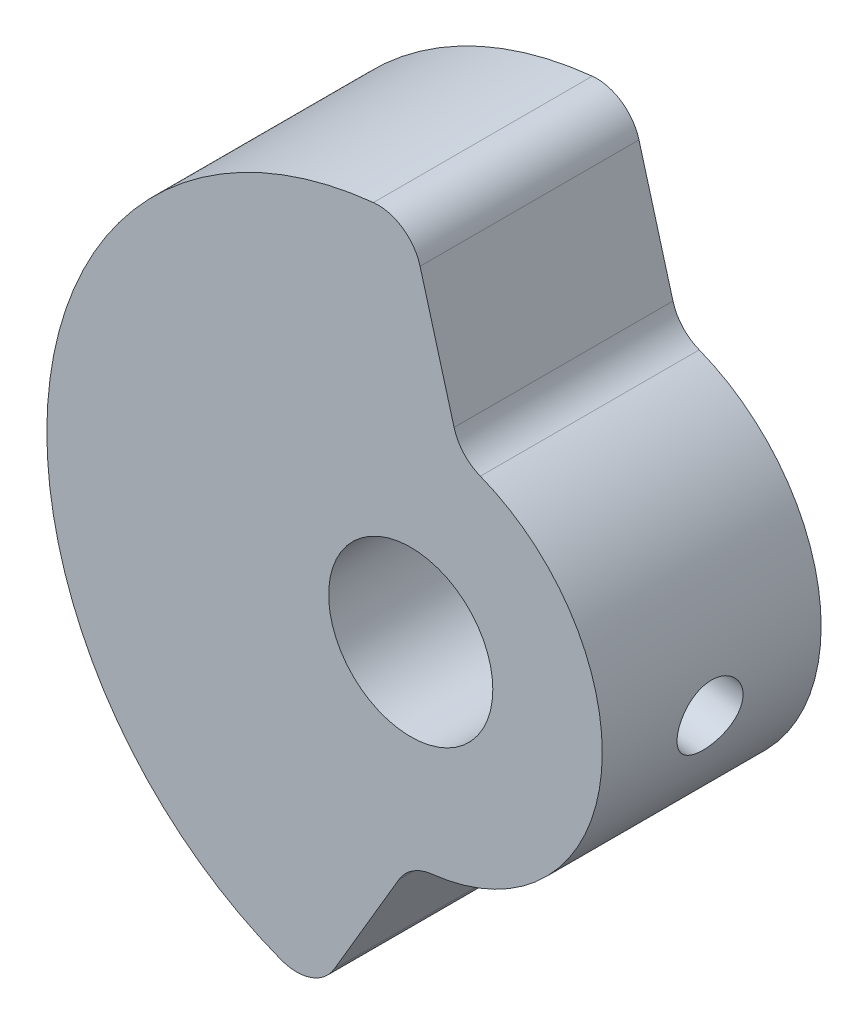
ISO-10303-21;
HEADER;
FILE_DESCRIPTION(('STEP AP214'),'2;1');
FILE_NAME('part.step','',(''),(''),'','','');
FILE_SCHEMA(('AUTOMOTIVE_DESIGN { 1 0 10303 214 1 1 1 1 }'));
ENDSEC;
DATA;
#1=APPLICATION_CONTEXT('core data for automotive mechanical design processes');
#2=APPLICATION_PROTOCOL_DEFINITION('international standard','automotive_design',2000,#1);
#3=PRODUCT_CONTEXT('',#1,'mechanical');
#4=PRODUCT('Part','Part','',(#3));
#5=PRODUCT_RELATED_PRODUCT_CATEGORY('part','',(#4));
#6=PRODUCT_DEFINITION_FORMATION('','',#4);
#7=PRODUCT_DEFINITION_CONTEXT('part definition',#1,'design');
#8=PRODUCT_DEFINITION('design','',#6,#7);
#9=PRODUCT_DEFINITION_SHAPE('','',#8);
#10=(LENGTH_UNIT() NAMED_UNIT(*) SI_UNIT(.MILLI.,.METRE.));
#11=(NAMED_UNIT(*) PLANE_ANGLE_UNIT() SI_UNIT($,.RADIAN.));
#12=(NAMED_UNIT(*) SI_UNIT($,.STERADIAN.) SOLID_ANGLE_UNIT());
#13=UNCERTAINTY_MEASURE_WITH_UNIT(LENGTH_MEASURE(1.E-05),#10,'distance_accuracy_value','');
#14=(GEOMETRIC_REPRESENTATION_CONTEXT(3) GLOBAL_UNCERTAINTY_ASSIGNED_CONTEXT((#13)) GLOBAL_UNIT_ASSIGNED_CONTEXT((#10,
#11,#12)) REPRESENTATION_CONTEXT('',''));
#15=CARTESIAN_POINT('',(0.,0.,0.));
#16=DIRECTION('',(0.,0.,1.));
#17=DIRECTION('',(1.,0.,0.));
#18=AXIS2_PLACEMENT_3D('',#15,#16,#17);
#19=CARTESIAN_POINT('',(5.43342531874596,1.50570839365895,12.7));
#20=DIRECTION('',(0.963681307706312,0.267054932883577,0.));
#21=DIRECTION('',(-0.267054932883577,0.963681307706312,0.));
#22=AXIS2_PLACEMENT_3D('',#19,#20,#21);
#23=PLANE('',#22);
#24=DIRECTION('',(0.267054932883577,-0.963681307706312,0.));
#25=VECTOR('',#24,1.);
#26=CARTESIAN_POINT('',(5.43342531874596,1.50570839365895,12.7));
#27=LINE('',#26,#25);
#28=CARTESIAN_POINT('',(0.543045489634812,19.1528927313957,12.7));
#29=VERTEX_POINT('',#28);
#30=CARTESIAN_POINT('',(2.51399029947362,12.0406381429719,12.7));
#31=VERTEX_POINT('',#30);
#32=EDGE_CURVE('E135',#29,#31,#27,.T.);
#33=ORIENTED_EDGE('',*,*,#32,.T.);
#34=DIRECTION('',(0.,0.,-1.));
#35=VECTOR('',#34,1.);
#36=CARTESIAN_POINT('',(2.51399029947362,12.0406381429719,12.7));
#37=LINE('',#36,#35);
#38=CARTESIAN_POINT('',(2.51399029947362,12.0406381429719,0.));
#39=VERTEX_POINT('',#38);
#40=EDGE_CURVE('E147',#31,#39,#37,.T.);
#41=ORIENTED_EDGE('',*,*,#40,.T.);
#42=DIRECTION('',(0.267054932883577,-0.963681307706312,0.));
#43=VECTOR('',#42,1.);
#44=CARTESIAN_POINT('',(5.43342531874596,1.50570839365895,0.));
#45=LINE('',#44,#43);
#46=CARTESIAN_POINT('',(0.543045489634812,19.1528927313957,0.));
#47=VERTEX_POINT('',#46);
#48=EDGE_CURVE('E177',#47,#39,#45,.T.);
#49=ORIENTED_EDGE('',*,*,#48,.F.);
#50=DIRECTION('',(0.,0.,1.));
#51=VECTOR('',#50,1.);
#52=CARTESIAN_POINT('',(0.543045489634813,19.1528927313957,12.7));
#53=LINE('',#52,#51);
#54=EDGE_CURVE('E145',#47,#29,#53,.T.);
#55=ORIENTED_EDGE('',*,*,#54,.T.);
#56=EDGE_LOOP('',(#33,#41,#49,#55));
#57=FACE_BOUND('',#56,.T.);
#58=ADVANCED_FACE('F39',(#57),#23,.T.);
#59=CARTESIAN_POINT('',(0.,0.,12.7));
#60=DIRECTION('',(0.,0.,-1.));
#61=DIRECTION('',(-1.,0.,0.));
#62=AXIS2_PLACEMENT_3D('',#59,#60,#61);
#63=CYLINDRICAL_SURFACE('',#62,21.1125);
#64=CARTESIAN_POINT('',(0.,0.,0.));
#65=DIRECTION('',(0.,0.,1.));
#66=DIRECTION('',(1.,0.,0.));
#67=AXIS2_PLACEMENT_3D('',#64,#65,#66);
#68=CIRCLE('',#67,21.1125);
#69=CARTESIAN_POINT('',(-2.16519504572981,21.0011806016697,0.));
#70=VERTEX_POINT('',#69);
#71=CARTESIAN_POINT('',(-7.5269233229733,-19.7251890115172,0.));
#72=VERTEX_POINT('',#71);
#73=EDGE_CURVE('E137',#70,#72,#68,.T.);
#74=ORIENTED_EDGE('',*,*,#73,.T.);
#75=DIRECTION('',(0.,0.,-1.));
#76=VECTOR('',#75,1.);
#77=CARTESIAN_POINT('',(-7.5269233229733,-19.7251890115172,12.7));
#78=LINE('',#77,#76);
#79=CARTESIAN_POINT('',(-7.5269233229733,-19.7251890115172,12.7));
#80=VERTEX_POINT('',#79);
#81=EDGE_CURVE('E54',#72,#80,#78,.F.);
#82=ORIENTED_EDGE('',*,*,#81,.T.);
#83=CARTESIAN_POINT('',(0.,0.,12.7));
#84=DIRECTION('',(0.,0.,1.));
#85=DIRECTION('',(1.,0.,0.));
#86=AXIS2_PLACEMENT_3D('',#83,#84,#85);
#87=CIRCLE('',#86,21.1125);
#88=CARTESIAN_POINT('',(-2.16519504572981,21.0011806016697,12.7));
#89=VERTEX_POINT('',#88);
#90=EDGE_CURVE('E168',#89,#80,#87,.T.);
#91=ORIENTED_EDGE('',*,*,#90,.F.);
#92=DIRECTION('',(0.,0.,-1.));
#93=VECTOR('',#92,1.);
#94=CARTESIAN_POINT('',(-2.16519504572981,21.0011806016697,12.7));
#95=LINE('',#94,#93);
#96=EDGE_CURVE('E154',#89,#70,#95,.T.);
#97=ORIENTED_EDGE('',*,*,#96,.T.);
#98=EDGE_LOOP('',(#74,#82,#91,#97));
#99=FACE_BOUND('',#98,.T.);
#100=ADVANCED_FACE('F180',(#99),#63,.T.);
#101=CARTESIAN_POINT('',(4.85857983193997,-2.8606765769291,12.7));
#102=DIRECTION('',(0.861725760706704,-0.507374332553838,0.));
#103=DIRECTION('',(0.507374332553838,0.861725760706704,0.));
#104=AXIS2_PLACEMENT_3D('',#101,#102,#103);
#105=PLANE('',#104);
#106=DIRECTION('',(-0.507374332553838,-0.861725760706704,0.));
#107=VECTOR('',#106,1.);
#108=CARTESIAN_POINT('',(4.85857983193997,-2.8606765769291,0.));
#109=LINE('',#108,#107);
#110=CARTESIAN_POINT('',(-0.688018309287222,-12.2810319160046,0.));
#111=VERTEX_POINT('',#110);
#112=CARTESIAN_POINT('',(-4.4325917444028,-18.6408242524738,0.));
#113=VERTEX_POINT('',#112);
#114=EDGE_CURVE('E132',#111,#113,#109,.T.);
#115=ORIENTED_EDGE('',*,*,#114,.F.);
#116=DIRECTION('',(0.,0.,-1.));
#117=VECTOR('',#116,1.);
#118=CARTESIAN_POINT('',(-0.688018309287221,-12.2810319160046,12.7));
#119=LINE('',#118,#117);
#120=CARTESIAN_POINT('',(-0.688018309287222,-12.2810319160046,12.7));
#121=VERTEX_POINT('',#120);
#122=EDGE_CURVE('E110',#111,#121,#119,.F.);
#123=ORIENTED_EDGE('',*,*,#122,.T.);
#124=DIRECTION('',(-0.507374332553838,-0.861725760706704,0.));
#125=VECTOR('',#124,1.);
#126=CARTESIAN_POINT('',(4.85857983193997,-2.8606765769291,12.7));
#127=LINE('',#126,#125);
#128=CARTESIAN_POINT('',(-4.4325917444028,-18.6408242524738,12.7));
#129=VERTEX_POINT('',#128);
#130=EDGE_CURVE('E164',#121,#129,#127,.T.);
#131=ORIENTED_EDGE('',*,*,#130,.T.);
#132=DIRECTION('',(0.,0.,1.));
#133=VECTOR('',#132,1.);
#134=CARTESIAN_POINT('',(-4.4325917444028,-18.6408242524738,0.));
#135=LINE('',#134,#133);
#136=EDGE_CURVE('E126',#129,#113,#135,.F.);
#137=ORIENTED_EDGE('',*,*,#136,.T.);
#138=EDGE_LOOP('',(#115,#123,#131,#137));
#139=FACE_BOUND('',#138,.T.);
#140=ADVANCED_FACE('F184',(#139),#105,.T.);
#141=CARTESIAN_POINT('',(0.,0.,12.7));
#142=DIRECTION('',(0.,0.,-1.));
#143=DIRECTION('',(-1.,0.,0.));
#144=AXIS2_PLACEMENT_3D('',#141,#142,#143);
#145=CYLINDRICAL_SURFACE('',#144,4.7625);
#146=CARTESIAN_POINT('',(4.57649482557353,1.31799141176969,6.35));
#147=CARTESIAN_POINT('',(4.5765035003887,1.3179790913622,6.24825854889232));
#148=CARTESIAN_POINT('',(4.57900603689043,1.30936790539881,6.14637142960715));
#149=CARTESIAN_POINT('',(4.58861076313625,1.27528431465179,5.94551805016252));
#150=CARTESIAN_POINT('',(4.59572475292533,1.24976865003831,5.8465599661598));
#151=CARTESIAN_POINT('',(4.61332879952334,1.18312217209409,5.65480991178216));
#152=CARTESIAN_POINT('',(4.62380616708721,1.14204994692109,5.56199632249306));
#153=CARTESIAN_POINT('',(4.64652081154571,1.04579436279778,5.38431394743353));
#154=CARTESIAN_POINT('',(4.65875769520724,0.990614154692842,5.2994433934575));
#155=CARTESIAN_POINT('',(4.68383138060495,0.864558047658976,5.13518589327512));
#156=CARTESIAN_POINT('',(4.69666661754263,0.793020091962644,5.05630656503448));
#157=CARTESIAN_POINT('',(4.72022592343371,0.637979512650587,4.91091532147242));
#158=CARTESIAN_POINT('',(4.73094925725567,0.55447274022887,4.8444077130629));
#159=CARTESIAN_POINT('',(4.74868238802908,0.374085241586445,4.72313378240749));
#160=CARTESIAN_POINT('',(4.75553046938425,0.276809075867375,4.6689286773879));
#161=CARTESIAN_POINT('',(4.7629951953723,0.0743236467275271,4.57758174027642));
#162=CARTESIAN_POINT('',(4.76361436185257,-0.0308823888125432,4.54043300853088));
#163=CARTESIAN_POINT('',(4.75751359187605,-0.240731951328283,4.48606269799038));
#164=CARTESIAN_POINT('',(4.75114542558981,-0.345158877277574,4.46796813989771));
#165=CARTESIAN_POINT('',(4.73123602626295,-0.554878351393519,4.44940953503026));
#166=CARTESIAN_POINT('',(4.71769745198341,-0.660170564477526,4.44893895798278));
#167=CARTESIAN_POINT('',(4.68482533031828,-0.862400609743883,4.46516144350376));
#168=CARTESIAN_POINT('',(4.66585731417635,-0.959476766199499,4.4808981992074));
#169=CARTESIAN_POINT('',(4.62289689054303,-1.14876191239522,4.52746301204533));
#170=CARTESIAN_POINT('',(4.59890411465393,-1.24097054464459,4.5582921759237));
#171=CARTESIAN_POINT('',(4.5469493748961,-1.41966680972163,4.63454594874746));
#172=CARTESIAN_POINT('',(4.51893310687645,-1.50604745001541,4.68018324592099));
#173=CARTESIAN_POINT('',(4.46102507018394,-1.66979513841288,4.78455915718808));
#174=CARTESIAN_POINT('',(4.43113266303987,-1.74715909216696,4.84330224889569));
#175=CARTESIAN_POINT('',(4.36952393988176,-1.89620400873576,4.97669163092466));
#176=CARTESIAN_POINT('',(4.33781592412643,-1.967184459157,5.05212566716467));
#177=CARTESIAN_POINT('',(4.27708381927617,-2.09595809568712,5.21450348241173));
#178=CARTESIAN_POINT('',(4.24806059859108,-2.15374702374397,5.30145096353974));
#179=CARTESIAN_POINT('',(4.19455745996124,-2.25622218809871,5.48747790762721));
#180=CARTESIAN_POINT('',(4.17022687744854,-2.30049791470839,5.58682815474876));
#181=CARTESIAN_POINT('',(4.12980814764151,-2.37230034274375,5.79297055153924));
#182=CARTESIAN_POINT('',(4.11371469020227,-2.39983783679155,5.89975785625664));
#183=CARTESIAN_POINT('',(4.09241814369781,-2.43596718224047,6.11080634664625));
#184=CARTESIAN_POINT('',(4.0866125649153,-2.44560886545311,6.2148265451844));
#185=CARTESIAN_POINT('',(4.08471043991915,-2.44878643405441,6.42318603263268));
#186=CARTESIAN_POINT('',(4.08861097999804,-2.44232715283645,6.52752521639412));
#187=CARTESIAN_POINT('',(4.10515561160564,-2.41440186923083,6.72737314328988));
#188=CARTESIAN_POINT('',(4.1172940075421,-2.39380305277959,6.82304797588751));
#189=CARTESIAN_POINT('',(4.14855367401966,-2.3392073120076,7.00928672988511));
#190=CARTESIAN_POINT('',(4.16767648636103,-2.30520742928872,7.09984951770805));
#191=CARTESIAN_POINT('',(4.21206999769849,-2.22308988130137,7.27737295640481));
#192=CARTESIAN_POINT('',(4.23755786010531,-2.17445735017657,7.36404026732357));
#193=CARTESIAN_POINT('',(4.29207355717854,-2.06476579579727,7.52789189723617));
#194=CARTESIAN_POINT('',(4.32110282410147,-2.00370173811671,7.60507235394205));
#195=CARTESIAN_POINT('',(4.38268374812765,-1.86537456322684,7.75363766651749));
#196=CARTESIAN_POINT('',(4.41533763910642,-1.78725228126425,7.82418334339339));
#197=CARTESIAN_POINT('',(4.47956286710892,-1.61956000939682,7.9506938780632));
#198=CARTESIAN_POINT('',(4.51113416253095,-1.52998958018924,8.00665817607154));
#199=CARTESIAN_POINT('',(4.57074610989932,-1.34143440974871,8.10220041692598));
#200=CARTESIAN_POINT('',(4.59878830927119,-1.24245382830189,8.14178555918838));
#201=CARTESIAN_POINT('',(4.64925449829528,-1.03774994760261,8.20301324182446));
#202=CARTESIAN_POINT('',(4.67168150980392,-0.932030313622901,8.22466544748846));
#203=CARTESIAN_POINT('',(4.70822436234517,-0.724182079828701,8.24827018035336));
#204=CARTESIAN_POINT('',(4.72278497783695,-0.622265418297731,8.25140952418151));
#205=CARTESIAN_POINT('',(4.74517784768901,-0.418553939784576,8.24102907101579));
#206=CARTESIAN_POINT('',(4.75301110852388,-0.31675910685213,8.22751176674786));
#207=CARTESIAN_POINT('',(4.76199736054659,-0.119414258209948,8.18504923974241));
#208=CARTESIAN_POINT('',(4.76334592252221,-0.0237684773881169,8.15658481016413));
#209=CARTESIAN_POINT('',(4.76065049011924,0.16203393232593,8.0855396852664));
#210=CARTESIAN_POINT('',(4.75660549750984,0.252189541876132,8.04295637794274));
#211=CARTESIAN_POINT('',(4.74402814313224,0.428692536269111,7.94276555532535));
#212=CARTESIAN_POINT('',(4.73530577101277,0.514696688099277,7.88457833224135));
#213=CARTESIAN_POINT('',(4.71492883507228,0.676391427690234,7.75570070759385));
#214=CARTESIAN_POINT('',(4.70327306831053,0.752077764592488,7.68500518010468));
#215=CARTESIAN_POINT('',(4.6781346802911,0.895597247433175,7.52798777584434));
#216=CARTESIAN_POINT('',(4.6645838298356,0.962662781654232,7.44097292355135));
#217=CARTESIAN_POINT('',(4.63857966928379,1.0810529320265,7.25660712002378));
#218=CARTESIAN_POINT('',(4.62612649132042,1.13237565496723,7.15925492752739));
#219=CARTESIAN_POINT('',(4.60548483932956,1.21347002062128,6.96582193643155));
#220=CARTESIAN_POINT('',(4.59701459570469,1.24475835485225,6.87040582888302));
#221=CARTESIAN_POINT('',(4.58416634426781,1.29129003148744,6.67564287335857));
#222=CARTESIAN_POINT('',(4.57977691244876,1.3065781807225,6.57630781501907));
#223=CARTESIAN_POINT('',(4.57691679435516,1.31652186394179,6.43438697538482));
#224=CARTESIAN_POINT('',(4.57649122694748,1.31799652271886,6.39220602163411));
#225=CARTESIAN_POINT('',(4.57649482557353,1.31799141176969,6.35));
#226=B_SPLINE_CURVE_WITH_KNOTS('',3,(#146,#147,#148,#149,#150,#151,#152,#153,#154,#155,#156,
#157,#158,#159,#160,#161,#162,#163,#164,#165,#166,#167,#168,#169,#170,#171,#172,#173,#174,#175,
#176,#177,#178,#179,#180,#181,#182,#183,#184,#185,#186,#187,#188,#189,#190,#191,#192,#193,#194,
#195,#196,#197,#198,#199,#200,#201,#202,#203,#204,#205,#206,#207,#208,#209,#210,#211,#212,#213,
#214,#215,#216,#217,#218,#219,#220,#221,#222,#223,#224,#225),.UNSPECIFIED.,.T.,.F.,(4,2,2,2,2,2,
2,2,2,2,2,2,2,2,2,2,2,2,2,2,2,2,2,2,2,2,2,2,2,2,2,2,2,2,2,2,2,2,2,4),(0.,0.305093849963129,
0.610971489482487,0.915708424940186,1.22037736049339,1.54073919281255,1.86121234340843,
2.19422460825775,2.52710204385605,2.84395930285961,3.16069915452013,3.45976416385432,
3.75885110726394,4.06243952061923,4.36613181467221,4.68964610005576,5.01326466444634,
5.34591141592365,5.67834345239779,5.99056931291459,6.30270145676866,6.59722418736117,
6.89181197277322,7.19830112258992,7.50491463986565,7.8339971814367,8.16309235477079,
8.4920427210975,8.8208156779082,9.1282608702742,9.4356600579738,9.73372769878002,
10.0318505131461,10.3431193970311,10.6545161361646,10.9850342935788,11.3155921831175,
11.616592463761,11.9167475508272,12.0433114782313),.UNSPECIFIED.);
#227=CARTESIAN_POINT('',(4.57649482557353,1.31799141176969,6.35));
#228=VERTEX_POINT('',#227);
#229=EDGE_CURVE('E227',#228,#228,#226,.T.);
#230=ORIENTED_EDGE('',*,*,#229,.F.);
#231=EDGE_LOOP('',(#230));
#232=FACE_BOUND('',#231,.T.);
#233=CARTESIAN_POINT('',(0.,0.,12.7));
#234=DIRECTION('',(0.,0.,1.));
#235=DIRECTION('',(1.,0.,0.));
#236=AXIS2_PLACEMENT_3D('',#233,#234,#235);
#237=CIRCLE('',#236,4.7625);
#238=CARTESIAN_POINT('',(4.7625,0.,12.7));
#239=VERTEX_POINT('',#238);
#240=EDGE_CURVE('E131',#239,#239,#237,.T.);
#241=ORIENTED_EDGE('',*,*,#240,.T.);
#242=EDGE_LOOP('',(#241));
#243=FACE_BOUND('',#242,.T.);
#244=CARTESIAN_POINT('',(0.,0.,0.));
#245=DIRECTION('',(0.,0.,1.));
#246=DIRECTION('',(1.,0.,0.));
#247=AXIS2_PLACEMENT_3D('',#244,#245,#246);
#248=CIRCLE('',#247,4.7625);
#249=CARTESIAN_POINT('',(4.7625,0.,0.));
#250=VERTEX_POINT('',#249);
#251=EDGE_CURVE('E174',#250,#250,#248,.T.);
#252=ORIENTED_EDGE('',*,*,#251,.F.);
#253=EDGE_LOOP('',(#252));
#254=FACE_BOUND('',#253,.T.);
#255=ADVANCED_FACE('F186',(#232,#243,#254),#145,.F.);
#256=CARTESIAN_POINT('',(0.,0.,12.7));
#257=DIRECTION('',(0.,0.,-1.));
#258=DIRECTION('',(-1.,0.,0.));
#259=AXIS2_PLACEMENT_3D('',#256,#257,#258);
#260=CYLINDRICAL_SURFACE('',#259,11.1125);
#261=CARTESIAN_POINT('',(11.1026812087218,0.467039856431215,6.35));
#262=CARTESIAN_POINT('',(11.1026825886214,0.467035422742552,6.24419047996461));
#263=CARTESIAN_POINT('',(11.1030711100835,0.458038966614972,6.13832415886727));
#264=CARTESIAN_POINT('',(11.1044858130582,0.422324869019031,5.92956476655545));
#265=CARTESIAN_POINT('',(11.1055125735094,0.395591136807543,5.82667448364436));
#266=CARTESIAN_POINT('',(11.1077933567441,0.325286566268326,5.62691846237677));
#267=CARTESIAN_POINT('',(11.109047184943,0.281730108180262,5.53004766038541));
#268=CARTESIAN_POINT('',(11.1111741329766,0.179127339116637,5.34490998614941));
#269=CARTESIAN_POINT('',(11.1120472930878,0.120082667923356,5.25664220443398));
#270=CARTESIAN_POINT('',(11.1126917461416,-0.0123803767803384,5.09029257035489));
#271=CARTESIAN_POINT('',(11.1124527511396,-0.0859269040364504,5.01231271188836));
#272=CARTESIAN_POINT('',(11.1100845418981,-0.244922403924324,4.86963891286457));
#273=CARTESIAN_POINT('',(11.1079552134239,-0.330372095612074,4.80494577552693));
#274=CARTESIAN_POINT('',(11.1011011606332,-0.511316763203209,4.69029743085464));
#275=CARTESIAN_POINT('',(11.0963602106821,-0.606871490257297,4.6404373928394));
#276=CARTESIAN_POINT('',(11.083761085431,-0.804809880959741,4.55748257567402));
#277=CARTESIAN_POINT('',(11.075903123111,-0.907193077633294,4.5243866514133));
#278=CARTESIAN_POINT('',(11.056929632562,-1.11477139596944,4.47621216472612));
#279=CARTESIAN_POINT('',(11.0458464099391,-1.21992965393842,4.46096211165126));
#280=CARTESIAN_POINT('',(11.0204984241901,-1.43092882246839,4.44837879018573));
#281=CARTESIAN_POINT('',(11.006233887899,-1.5367696838359,4.45104424477146));
#282=CARTESIAN_POINT('',(10.9751396827207,-1.74497406559829,4.47408296297788));
#283=CARTESIAN_POINT('',(10.9583382542887,-1.8473623116023,4.49427165156415));
#284=CARTESIAN_POINT('',(10.9228142770746,-2.04696547390339,4.55149286940208));
#285=CARTESIAN_POINT('',(10.9040916674881,-2.14418022631406,4.58852593189708));
#286=CARTESIAN_POINT('',(10.8656329422048,-2.33127681409368,4.67856663637872));
#287=CARTESIAN_POINT('',(10.8458924041399,-2.42112132155508,4.73164989536666));
#288=CARTESIAN_POINT('',(10.8066615143264,-2.59061827795492,4.85222869585106));
#289=CARTESIAN_POINT('',(10.7871711839801,-2.67026986016612,4.91972546165966));
#290=CARTESIAN_POINT('',(10.7494589211,-2.8182809459278,5.068237768501));
#291=CARTESIAN_POINT('',(10.7312563235424,-2.88648356856857,5.14941466476666));
#292=CARTESIAN_POINT('',(10.6976785327011,-3.00854619682204,5.32244044499443));
#293=CARTESIAN_POINT('',(10.6823033681406,-3.06240605673341,5.4142894373557));
#294=CARTESIAN_POINT('',(10.6555084952277,-3.15437847509528,5.60624049074846));
#295=CARTESIAN_POINT('',(10.6440936422308,-3.19247171457406,5.7063524975177));
#296=CARTESIAN_POINT('',(10.626141706969,-3.25172825222864,5.91188249155916));
#297=CARTESIAN_POINT('',(10.6196041719047,-3.27289312200999,6.01729998531149));
#298=CARTESIAN_POINT('',(10.611983946429,-3.29751713475468,6.22903215839901));
#299=CARTESIAN_POINT('',(10.6108338554269,-3.30119506007527,6.33531899330574));
#300=CARTESIAN_POINT('',(10.6138973572043,-3.29133176821848,6.54700896474408));
#301=CARTESIAN_POINT('',(10.6181107317834,-3.27779125153385,6.65241213704989));
#302=CARTESIAN_POINT('',(10.6315184074989,-3.23403541759905,6.85862115842637));
#303=CARTESIAN_POINT('',(10.6406792064538,-3.20393223136703,6.959453040592));
#304=CARTESIAN_POINT('',(10.6632564046978,-3.12796736423503,7.15448492568359));
#305=CARTESIAN_POINT('',(10.676673070155,-3.08210469769902,7.24868451336571));
#306=CARTESIAN_POINT('',(10.7069218166919,-2.97532832118813,7.4287801973464));
#307=CARTESIAN_POINT('',(10.7237856784368,-2.91427331950585,7.51458716415811));
#308=CARTESIAN_POINT('',(10.7596486147981,-2.7789398305482,7.67453899834679));
#309=CARTESIAN_POINT('',(10.7786478475179,-2.70466036389219,7.74868300121863));
#310=CARTESIAN_POINT('',(10.8177210240051,-2.54390868747545,7.88403190655042));
#311=CARTESIAN_POINT('',(10.8378044653135,-2.45731175295213,7.94508606967813));
#312=CARTESIAN_POINT('',(10.8775638815691,-2.27485504075991,8.051464814822));
#313=CARTESIAN_POINT('',(10.8972398701871,-2.17899557447825,8.09678992538144));
#314=CARTESIAN_POINT('',(10.9349450801345,-1.9810916347535,8.17019108227502));
#315=CARTESIAN_POINT('',(10.9529814216345,-1.87907745468468,8.19834507191093));
#316=CARTESIAN_POINT('',(10.9865960887827,-1.67135402142563,8.23685538222977));
#317=CARTESIAN_POINT('',(11.0021746273291,-1.56564508925001,8.24721324520754));
#318=CARTESIAN_POINT('',(11.0300910008443,-1.35495383404554,8.24979110365727));
#319=CARTESIAN_POINT('',(11.0424675345907,-1.24997937043597,8.24224012190431));
#320=CARTESIAN_POINT('',(11.0639904101107,-1.0424303092605,8.20971119826643));
#321=CARTESIAN_POINT('',(11.0731367722616,-0.939855696559161,8.18473336632037));
#322=CARTESIAN_POINT('',(11.08827527225,-0.74015656119689,8.11814936043393));
#323=CARTESIAN_POINT('',(11.0942712635913,-0.643025510617081,8.07656361130237));
#324=CARTESIAN_POINT('',(11.1034993993315,-0.456793838757659,7.97797008486282));
#325=CARTESIAN_POINT('',(11.1067314019715,-0.367693629572389,7.92096151674874));
#326=CARTESIAN_POINT('',(11.1110430901067,-0.19898343504303,7.79233319292389));
#327=CARTESIAN_POINT('',(11.112096453478,-0.119500313589098,7.72054614051716));
#328=CARTESIAN_POINT('',(11.1127088143514,0.0264636860410284,7.56474908883566));
#329=CARTESIAN_POINT('',(11.1122674617145,0.0929415138544083,7.48073623006364));
#330=CARTESIAN_POINT('',(11.110649096403,0.211369195324088,7.30212503506191));
#331=CARTESIAN_POINT('',(11.1094666069557,0.263206687326611,7.20745223627305));
#332=CARTESIAN_POINT('',(11.1070714011094,0.350033805367525,7.0107437435459));
#333=CARTESIAN_POINT('',(11.1058587158439,0.385040085598831,6.90871544321103));
#334=CARTESIAN_POINT('',(11.1042064824423,0.429635053890683,6.7302561390265));
#335=CARTESIAN_POINT('',(11.1036448931649,0.443637828110734,6.6548992908093));
#336=CARTESIAN_POINT('',(11.1028817608015,0.462341741149239,6.5030381858577));
#337=CARTESIAN_POINT('',(11.1026802106154,0.467043063398926,6.42653395178054));
#338=CARTESIAN_POINT('',(11.1026812087218,0.467039856431215,6.35));
#339=B_SPLINE_CURVE_WITH_KNOTS('',3,(#261,#262,#263,#264,#265,#266,#267,#268,#269,#270,#271,
#272,#273,#274,#275,#276,#277,#278,#279,#280,#281,#282,#283,#284,#285,#286,#287,#288,#289,#290,
#291,#292,#293,#294,#295,#296,#297,#298,#299,#300,#301,#302,#303,#304,#305,#306,#307,#308,#309,
#310,#311,#312,#313,#314,#315,#316,#317,#318,#319,#320,#321,#322,#323,#324,#325,#326,#327,#328,
#329,#330,#331,#332,#333,#334,#335,#336,#337,#338),.UNSPECIFIED.,.T.,.F.,(4,2,2,2,2,2,2,2,2,2,2,
2,2,2,2,2,2,2,2,2,2,2,2,2,2,2,2,2,2,2,2,2,2,2,2,2,2,2,4),(0.,0.317148651021595,
0.634585404215513,0.951751407616913,1.26888384527228,1.58895570430241,1.909046906884,
2.23114959391514,2.55323027602808,2.87218981114865,3.19112661096407,3.50674421428092,
3.82237180981814,4.13951021999885,4.45667557927459,4.77788381003998,5.09909530368305,
5.42069922353055,5.74227328266499,6.05981329111992,6.3773403816023,6.69274377002277,
7.00816688812565,7.32664096473194,7.64513863678742,7.96712749152722,8.28910552542914,
8.60961093986238,8.9300885764089,9.24649000661016,9.56288944078249,9.87890095184614,
10.1949286694936,10.5147528168835,10.8346518886192,11.1569432478586,11.4789150457108,
11.7083189617698,11.9377183537757),.UNSPECIFIED.);
#340=CARTESIAN_POINT('',(11.1026812087218,0.467039856431215,6.35));
#341=VERTEX_POINT('',#340);
#342=EDGE_CURVE('E178',#341,#341,#339,.T.);
#343=ORIENTED_EDGE('',*,*,#342,.T.);
#344=EDGE_LOOP('',(#343));
#345=FACE_BOUND('',#344,.T.);
#346=CARTESIAN_POINT('',(0.,0.,12.7));
#347=DIRECTION('',(0.,0.,1.));
#348=DIRECTION('',(1.,0.,0.));
#349=AXIS2_PLACEMENT_3D('',#346,#347,#348);
#350=CIRCLE('',#349,11.1125);
#351=CARTESIAN_POINT('',(1.22155300701798,-11.0451557028883,12.7));
#352=VERTEX_POINT('',#351);
#353=CARTESIAN_POINT('',(4.03862624968995,10.3526399659853,12.7));
#354=VERTEX_POINT('',#353);
#355=EDGE_CURVE('E125',#352,#354,#350,.T.);
#356=ORIENTED_EDGE('',*,*,#355,.F.);
#357=DIRECTION('',(0.,0.,-1.));
#358=VECTOR('',#357,1.);
#359=CARTESIAN_POINT('',(1.22155300701798,-11.0451557028883,12.7));
#360=LINE('',#359,#358);
#361=CARTESIAN_POINT('',(1.22155300701798,-11.0451557028883,0.));
#362=VERTEX_POINT('',#361);
#363=EDGE_CURVE('E109',#352,#362,#360,.T.);
#364=ORIENTED_EDGE('',*,*,#363,.T.);
#365=CARTESIAN_POINT('',(0.,0.,0.));
#366=DIRECTION('',(0.,0.,1.));
#367=DIRECTION('',(1.,0.,0.));
#368=AXIS2_PLACEMENT_3D('',#365,#366,#367);
#369=CIRCLE('',#368,11.1125);
#370=CARTESIAN_POINT('',(4.03862624968995,10.3526399659853,0.));
#371=VERTEX_POINT('',#370);
#372=EDGE_CURVE('E122',#362,#371,#369,.T.);
#373=ORIENTED_EDGE('',*,*,#372,.T.);
#374=DIRECTION('',(0.,0.,-1.));
#375=VECTOR('',#374,1.);
#376=CARTESIAN_POINT('',(4.03862624968996,10.3526399659853,12.7));
#377=LINE('',#376,#375);
#378=EDGE_CURVE('E127',#371,#354,#377,.F.);
#379=ORIENTED_EDGE('',*,*,#378,.T.);
#380=EDGE_LOOP('',(#356,#364,#373,#379));
#381=FACE_BOUND('',#380,.T.);
#382=ADVANCED_FACE('F121',(#345,#381),#260,.T.);
#383=CARTESIAN_POINT('',(0.,0.,12.7));
#384=DIRECTION('',(0.,0.,1.));
#385=DIRECTION('',(1.,0.,0.));
#386=AXIS2_PLACEMENT_3D('',#383,#384,#385);
#387=PLANE('',#386);
#388=ORIENTED_EDGE('',*,*,#240,.F.);
#389=EDGE_LOOP('',(#388));
#390=FACE_BOUND('',#389,.T.);
#391=ORIENTED_EDGE('',*,*,#90,.T.);
#392=CARTESIAN_POINT('',(-6.62137517659783,-17.352093447787,12.7));
#393=DIRECTION('',(0.,0.,1.));
#394=DIRECTION('',(1.,0.,0.));
#395=AXIS2_PLACEMENT_3D('',#392,#393,#394);
#396=CIRCLE('',#395,2.54);
#397=EDGE_CURVE('E116',#80,#129,#396,.T.);
#398=ORIENTED_EDGE('',*,*,#397,.T.);
#399=ORIENTED_EDGE('',*,*,#130,.F.);
#400=CARTESIAN_POINT('',(1.50076512290781,-13.5697627206913,12.7));
#401=DIRECTION('',(0.,0.,1.));
#402=DIRECTION('',(1.,0.,0.));
#403=AXIS2_PLACEMENT_3D('',#400,#401,#402);
#404=CIRCLE('',#403,2.54);
#405=EDGE_CURVE('E115',#121,#352,#404,.F.);
#406=ORIENTED_EDGE('',*,*,#405,.T.);
#407=ORIENTED_EDGE('',*,*,#355,.T.);
#408=CARTESIAN_POINT('',(4.96174082104766,12.7189576724962,12.7));
#409=DIRECTION('',(0.,0.,1.));
#410=DIRECTION('',(1.,0.,0.));
#411=AXIS2_PLACEMENT_3D('',#408,#409,#410);
#412=CIRCLE('',#411,2.54);
#413=EDGE_CURVE('E11',#354,#31,#412,.F.);
#414=ORIENTED_EDGE('',*,*,#413,.T.);
#415=ORIENTED_EDGE('',*,*,#32,.F.);
#416=CARTESIAN_POINT('',(-1.90470503193922,18.4745732018714,12.7));
#417=DIRECTION('',(0.,0.,1.));
#418=DIRECTION('',(1.,0.,0.));
#419=AXIS2_PLACEMENT_3D('',#416,#417,#418);
#420=CIRCLE('',#419,2.54);
#421=EDGE_CURVE('E61',#29,#89,#420,.T.);
#422=ORIENTED_EDGE('',*,*,#421,.T.);
#423=EDGE_LOOP('',(#391,#398,#399,#406,#407,#414,#415,#422));
#424=FACE_BOUND('',#423,.T.);
#425=ADVANCED_FACE('F161',(#390,#424),#387,.T.);
#426=CARTESIAN_POINT('',(0.,0.,0.));
#427=DIRECTION('',(0.,0.,1.));
#428=DIRECTION('',(1.,0.,0.));
#429=AXIS2_PLACEMENT_3D('',#426,#427,#428);
#430=PLANE('',#429);
#431=ORIENTED_EDGE('',*,*,#251,.T.);
#432=EDGE_LOOP('',(#431));
#433=FACE_BOUND('',#432,.T.);
#434=ORIENTED_EDGE('',*,*,#114,.T.);
#435=CARTESIAN_POINT('',(-6.62137517659783,-17.352093447787,0.));
#436=DIRECTION('',(0.,0.,1.));
#437=DIRECTION('',(1.,0.,0.));
#438=AXIS2_PLACEMENT_3D('',#435,#436,#437);
#439=CIRCLE('',#438,2.54);
#440=EDGE_CURVE('E152',#113,#72,#439,.F.);
#441=ORIENTED_EDGE('',*,*,#440,.T.);
#442=ORIENTED_EDGE('',*,*,#73,.F.);
#443=CARTESIAN_POINT('',(-1.90470503193922,18.4745732018714,0.));
#444=DIRECTION('',(0.,0.,1.));
#445=DIRECTION('',(1.,0.,0.));
#446=AXIS2_PLACEMENT_3D('',#443,#444,#445);
#447=CIRCLE('',#446,2.54);
#448=EDGE_CURVE('E150',#70,#47,#447,.F.);
#449=ORIENTED_EDGE('',*,*,#448,.T.);
#450=ORIENTED_EDGE('',*,*,#48,.T.);
#451=CARTESIAN_POINT('',(4.96174082104766,12.7189576724962,0.));
#452=DIRECTION('',(0.,0.,1.));
#453=DIRECTION('',(1.,0.,0.));
#454=AXIS2_PLACEMENT_3D('',#451,#452,#453);
#455=CIRCLE('',#454,2.54);
#456=EDGE_CURVE('E47',#39,#371,#455,.T.);
#457=ORIENTED_EDGE('',*,*,#456,.T.);
#458=ORIENTED_EDGE('',*,*,#372,.F.);
#459=CARTESIAN_POINT('',(1.50076512290781,-13.5697627206913,0.));
#460=DIRECTION('',(0.,0.,1.));
#461=DIRECTION('',(1.,0.,0.));
#462=AXIS2_PLACEMENT_3D('',#459,#460,#461);
#463=CIRCLE('',#462,2.54);
#464=EDGE_CURVE('E105',#362,#111,#463,.T.);
#465=ORIENTED_EDGE('',*,*,#464,.T.);
#466=EDGE_LOOP('',(#434,#441,#442,#449,#450,#457,#458,#465));
#467=FACE_BOUND('',#466,.T.);
#468=ADVANCED_FACE('F129',(#433,#467),#430,.F.);
#469=CARTESIAN_POINT('',(1.50076512290781,-13.5697627206913,12.7));
#470=DIRECTION('',(0.,0.,-1.));
#471=DIRECTION('',(-1.,0.,0.));
#472=AXIS2_PLACEMENT_3D('',#469,#470,#471);
#473=CYLINDRICAL_SURFACE('',#472,2.54);
#474=ORIENTED_EDGE('',*,*,#405,.F.);
#475=ORIENTED_EDGE('',*,*,#122,.F.);
#476=ORIENTED_EDGE('',*,*,#464,.F.);
#477=ORIENTED_EDGE('',*,*,#363,.F.);
#478=EDGE_LOOP('',(#474,#475,#476,#477));
#479=FACE_BOUND('',#478,.T.);
#480=ADVANCED_FACE('F108',(#479),#473,.F.);
#481=CARTESIAN_POINT('',(4.96174082104766,12.7189576724962,12.7));
#482=DIRECTION('',(0.,0.,-1.));
#483=DIRECTION('',(-1.,0.,0.));
#484=AXIS2_PLACEMENT_3D('',#481,#482,#483);
#485=CYLINDRICAL_SURFACE('',#484,2.54);
#486=ORIENTED_EDGE('',*,*,#413,.F.);
#487=ORIENTED_EDGE('',*,*,#378,.F.);
#488=ORIENTED_EDGE('',*,*,#456,.F.);
#489=ORIENTED_EDGE('',*,*,#40,.F.);
#490=EDGE_LOOP('',(#486,#487,#488,#489));
#491=FACE_BOUND('',#490,.T.);
#492=ADVANCED_FACE('F205',(#491),#485,.F.);
#493=CARTESIAN_POINT('',(-6.62137517659783,-17.352093447787,12.7));
#494=DIRECTION('',(0.,0.,-1.));
#495=DIRECTION('',(-1.,0.,0.));
#496=AXIS2_PLACEMENT_3D('',#493,#494,#495);
#497=CYLINDRICAL_SURFACE('',#496,2.54);
#498=ORIENTED_EDGE('',*,*,#397,.F.);
#499=ORIENTED_EDGE('',*,*,#81,.F.);
#500=ORIENTED_EDGE('',*,*,#440,.F.);
#501=ORIENTED_EDGE('',*,*,#136,.F.);
#502=EDGE_LOOP('',(#498,#499,#500,#501));
#503=FACE_BOUND('',#502,.T.);
#504=ADVANCED_FACE('F183',(#503),#497,.T.);
#505=CARTESIAN_POINT('',(-1.90470503193922,18.4745732018714,12.7));
#506=DIRECTION('',(0.,0.,-1.));
#507=DIRECTION('',(-1.,0.,0.));
#508=AXIS2_PLACEMENT_3D('',#505,#506,#507);
#509=CYLINDRICAL_SURFACE('',#508,2.54);
#510=ORIENTED_EDGE('',*,*,#421,.F.);
#511=ORIENTED_EDGE('',*,*,#54,.F.);
#512=ORIENTED_EDGE('',*,*,#448,.F.);
#513=ORIENTED_EDGE('',*,*,#96,.F.);
#514=EDGE_LOOP('',(#510,#511,#512,#513));
#515=FACE_BOUND('',#514,.T.);
#516=ADVANCED_FACE('F41',(#515),#509,.T.);
#517=CARTESIAN_POINT('',(11.0192223873,-1.43679997453122,6.35));
#518=DIRECTION('',(0.991606064349578,-0.129295835761019,0.));
#519=DIRECTION('',(0.129295835761019,0.991606064349578,0.));
#520=AXIS2_PLACEMENT_3D('',#517,#518,#519);
#521=CYLINDRICAL_SURFACE('',#520,1.89865);
#522=ORIENTED_EDGE('',*,*,#229,.T.);
#523=EDGE_LOOP('',(#522));
#524=FACE_BOUND('',#523,.T.);
#525=ORIENTED_EDGE('',*,*,#342,.F.);
#526=EDGE_LOOP('',(#525));
#527=FACE_BOUND('',#526,.T.);
#528=ADVANCED_FACE('F212',(#524,#527),#521,.F.);
#529=CLOSED_SHELL('',(#58,#100,#140,#255,#382,#425,#468,#480,#492,#504,#516,#528));
#530=MANIFOLD_SOLID_BREP('B2',#529);
#531=ADVANCED_BREP_SHAPE_REPRESENTATION('',(#18,#530),#14);
#532=SHAPE_DEFINITION_REPRESENTATION(#9,#531);
ENDSEC;
END-ISO-10303-21;
